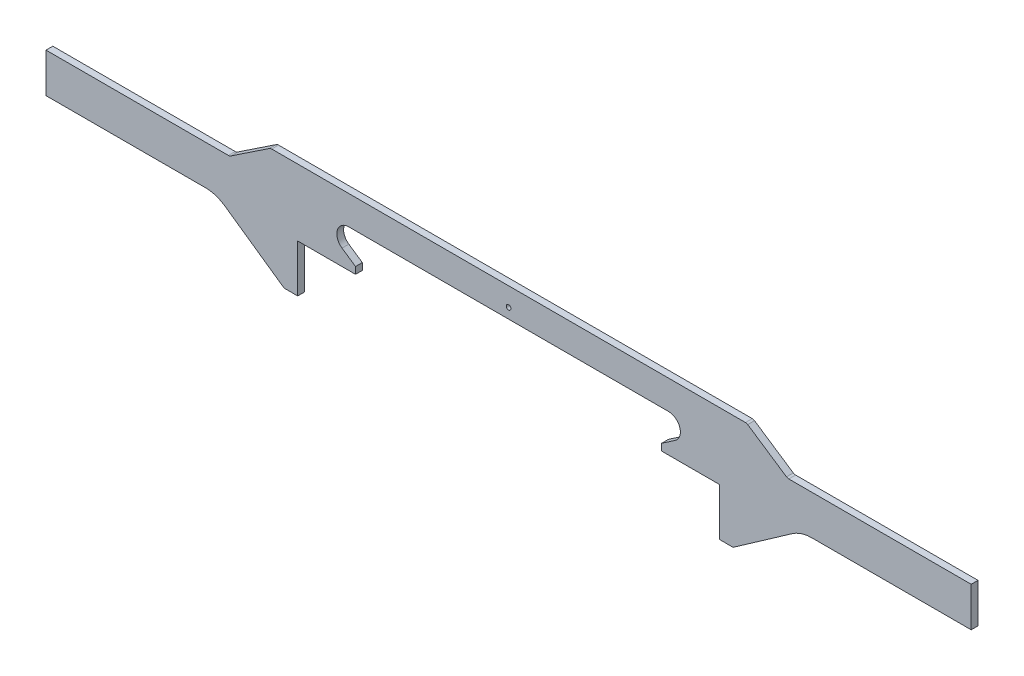
ISO-10303-21;
HEADER;
FILE_DESCRIPTION(('STEP AP214'),'2;1');
FILE_NAME('part.step','',(''),(''),'','','');
FILE_SCHEMA(('AUTOMOTIVE_DESIGN { 1 0 10303 214 1 1 1 1 }'));
ENDSEC;
DATA;
#1=APPLICATION_CONTEXT('core data for automotive mechanical design processes');
#2=APPLICATION_PROTOCOL_DEFINITION('international standard','automotive_design',2000,#1);
#3=PRODUCT_CONTEXT('',#1,'mechanical');
#4=PRODUCT('Part','Part','',(#3));
#5=PRODUCT_RELATED_PRODUCT_CATEGORY('part','',(#4));
#6=PRODUCT_DEFINITION_FORMATION('','',#4);
#7=PRODUCT_DEFINITION_CONTEXT('part definition',#1,'design');
#8=PRODUCT_DEFINITION('design','',#6,#7);
#9=PRODUCT_DEFINITION_SHAPE('','',#8);
#10=(LENGTH_UNIT() NAMED_UNIT(*) SI_UNIT(.MILLI.,.METRE.));
#11=(NAMED_UNIT(*) PLANE_ANGLE_UNIT() SI_UNIT($,.RADIAN.));
#12=(NAMED_UNIT(*) SI_UNIT($,.STERADIAN.) SOLID_ANGLE_UNIT());
#13=UNCERTAINTY_MEASURE_WITH_UNIT(LENGTH_MEASURE(1.E-05),#10,'distance_accuracy_value','');
#14=(GEOMETRIC_REPRESENTATION_CONTEXT(3) GLOBAL_UNCERTAINTY_ASSIGNED_CONTEXT((#13)) GLOBAL_UNIT_ASSIGNED_CONTEXT((#10,
#11,#12)) REPRESENTATION_CONTEXT('',''));
#15=CARTESIAN_POINT('',(0.,0.,0.));
#16=DIRECTION('',(0.,0.,1.));
#17=DIRECTION('',(1.,0.,0.));
#18=AXIS2_PLACEMENT_3D('',#15,#16,#17);
#19=CARTESIAN_POINT('',(-350.,-1.20408176090934E-13,10.));
#20=DIRECTION('',(0.554700196225223,-0.832050294337847,0.));
#21=DIRECTION('',(0.832050294337847,0.554700196225223,0.));
#22=AXIS2_PLACEMENT_3D('',#19,#20,#21);
#23=PLANE('',#22);
#24=DIRECTION('',(-0.832050294337848,-0.554700196225223,0.));
#25=VECTOR('',#24,1.);
#26=CARTESIAN_POINT('',(-350.,-1.20408176090934E-13,0.));
#27=LINE('',#26,#25);
#28=CARTESIAN_POINT('',(-351.511547350959,-1.00769823397302,0.));
#29=VERTEX_POINT('',#28);
#30=CARTESIAN_POINT('',(-408.488452649041,-38.9923017660266,0.));
#31=VERTEX_POINT('',#30);
#32=EDGE_CURVE('E308',#29,#31,#27,.T.);
#33=ORIENTED_EDGE('',*,*,#32,.T.);
#34=DIRECTION('',(0.,0.,-1.));
#35=VECTOR('',#34,1.);
#36=CARTESIAN_POINT('',(-408.488452649041,-38.9923017660266,10.));
#37=LINE('',#36,#35);
#38=CARTESIAN_POINT('',(-408.488452649041,-38.9923017660266,10.));
#39=VERTEX_POINT('',#38);
#40=EDGE_CURVE('E433',#31,#39,#37,.F.);
#41=ORIENTED_EDGE('',*,*,#40,.T.);
#42=DIRECTION('',(-0.832050294337848,-0.554700196225223,0.));
#43=VECTOR('',#42,1.);
#44=CARTESIAN_POINT('',(-350.,-1.20408176090934E-13,10.));
#45=LINE('',#44,#43);
#46=CARTESIAN_POINT('',(-351.511547350959,-1.00769823397302,10.));
#47=VERTEX_POINT('',#46);
#48=EDGE_CURVE('E245',#47,#39,#45,.T.);
#49=ORIENTED_EDGE('',*,*,#48,.F.);
#50=DIRECTION('',(0.,0.,-1.));
#51=VECTOR('',#50,1.);
#52=CARTESIAN_POINT('',(-351.511547350959,-1.00769823397302,10.));
#53=LINE('',#52,#51);
#54=EDGE_CURVE('E430',#47,#29,#53,.T.);
#55=ORIENTED_EDGE('',*,*,#54,.T.);
#56=EDGE_LOOP('',(#33,#41,#49,#55));
#57=FACE_BOUND('',#56,.T.);
#58=ADVANCED_FACE('F36',(#57),#23,.F.);
#59=CARTESIAN_POINT('',(-410.,-39.9999999999995,10.));
#60=DIRECTION('',(0.,-1.,0.));
#61=DIRECTION('',(1.,0.,0.));
#62=AXIS2_PLACEMENT_3D('',#59,#60,#61);
#63=PLANE('',#62);
#64=DIRECTION('',(-1.,0.,0.));
#65=VECTOR('',#64,1.);
#66=CARTESIAN_POINT('',(-410.,-39.9999999999995,10.));
#67=LINE('',#66,#65);
#68=CARTESIAN_POINT('',(-411.816653826392,-39.9999999999995,10.));
#69=VERTEX_POINT('',#68);
#70=CARTESIAN_POINT('',(-680.,-39.9999999999996,10.));
#71=VERTEX_POINT('',#70);
#72=EDGE_CURVE('E232',#69,#71,#67,.T.);
#73=ORIENTED_EDGE('',*,*,#72,.F.);
#74=DIRECTION('',(0.,0.,-1.));
#75=VECTOR('',#74,1.);
#76=CARTESIAN_POINT('',(-411.816653826392,-39.9999999999995,0.));
#77=LINE('',#76,#75);
#78=CARTESIAN_POINT('',(-411.816653826392,-39.9999999999995,0.));
#79=VERTEX_POINT('',#78);
#80=EDGE_CURVE('E428',#69,#79,#77,.T.);
#81=ORIENTED_EDGE('',*,*,#80,.T.);
#82=DIRECTION('',(-1.,0.,0.));
#83=VECTOR('',#82,1.);
#84=CARTESIAN_POINT('',(-410.,-39.9999999999995,0.));
#85=LINE('',#84,#83);
#86=CARTESIAN_POINT('',(-680.,-39.9999999999996,0.));
#87=VERTEX_POINT('',#86);
#88=EDGE_CURVE('E251',#79,#87,#85,.T.);
#89=ORIENTED_EDGE('',*,*,#88,.T.);
#90=DIRECTION('',(0.,0.,-1.));
#91=VECTOR('',#90,1.);
#92=CARTESIAN_POINT('',(-680.,-39.9999999999996,10.));
#93=LINE('',#92,#91);
#94=EDGE_CURVE('E248',#71,#87,#93,.T.);
#95=ORIENTED_EDGE('',*,*,#94,.F.);
#96=EDGE_LOOP('',(#73,#81,#89,#95));
#97=FACE_BOUND('',#96,.T.);
#98=ADVANCED_FACE('F249',(#97),#63,.F.);
#99=CARTESIAN_POINT('',(-680.,-39.9999999999996,10.));
#100=DIRECTION('',(1.,0.,0.));
#101=DIRECTION('',(0.,0.,-1.));
#102=AXIS2_PLACEMENT_3D('',#99,#100,#101);
#103=PLANE('',#102);
#104=DIRECTION('',(0.,-1.,0.));
#105=VECTOR('',#104,1.);
#106=CARTESIAN_POINT('',(-680.,-39.9999999999996,0.));
#107=LINE('',#106,#105);
#108=CARTESIAN_POINT('',(-680.,-97.9999999999996,0.));
#109=VERTEX_POINT('',#108);
#110=EDGE_CURVE('E313',#87,#109,#107,.T.);
#111=ORIENTED_EDGE('',*,*,#110,.T.);
#112=DIRECTION('',(0.,0.,-1.));
#113=VECTOR('',#112,1.);
#114=CARTESIAN_POINT('',(-680.,-97.9999999999996,10.));
#115=LINE('',#114,#113);
#116=CARTESIAN_POINT('',(-680.,-97.9999999999996,10.));
#117=VERTEX_POINT('',#116);
#118=EDGE_CURVE('E255',#117,#109,#115,.T.);
#119=ORIENTED_EDGE('',*,*,#118,.F.);
#120=DIRECTION('',(0.,-1.,0.));
#121=VECTOR('',#120,1.);
#122=CARTESIAN_POINT('',(-680.,-39.9999999999996,10.));
#123=LINE('',#122,#121);
#124=EDGE_CURVE('E237',#71,#117,#123,.T.);
#125=ORIENTED_EDGE('',*,*,#124,.F.);
#126=ORIENTED_EDGE('',*,*,#94,.T.);
#127=EDGE_LOOP('',(#111,#119,#125,#126));
#128=FACE_BOUND('',#127,.T.);
#129=ADVANCED_FACE('F257',(#128),#103,.F.);
#130=CARTESIAN_POINT('',(-680.,-97.9999999999996,10.));
#131=DIRECTION('',(0.,1.,0.));
#132=DIRECTION('',(-1.,0.,0.));
#133=AXIS2_PLACEMENT_3D('',#130,#131,#132);
#134=PLANE('',#133);
#135=DIRECTION('',(1.,0.,0.));
#136=VECTOR('',#135,1.);
#137=CARTESIAN_POINT('',(-680.,-97.9999999999996,0.));
#138=LINE('',#137,#136);
#139=CARTESIAN_POINT('',(-445.735299915897,-97.9999999999996,0.));
#140=VERTEX_POINT('',#139);
#141=EDGE_CURVE('E315',#109,#140,#138,.T.);
#142=ORIENTED_EDGE('',*,*,#141,.T.);
#143=DIRECTION('',(0.,0.,-1.));
#144=VECTOR('',#143,1.);
#145=CARTESIAN_POINT('',(-445.735299915897,-97.9999999999996,10.));
#146=LINE('',#145,#144);
#147=CARTESIAN_POINT('',(-445.735299915897,-97.9999999999996,10.));
#148=VERTEX_POINT('',#147);
#149=EDGE_CURVE('E51',#140,#148,#146,.F.);
#150=ORIENTED_EDGE('',*,*,#149,.T.);
#151=DIRECTION('',(1.,0.,0.));
#152=VECTOR('',#151,1.);
#153=CARTESIAN_POINT('',(-680.,-97.9999999999996,10.));
#154=LINE('',#153,#152);
#155=EDGE_CURVE('E259',#117,#148,#154,.T.);
#156=ORIENTED_EDGE('',*,*,#155,.F.);
#157=ORIENTED_EDGE('',*,*,#118,.T.);
#158=EDGE_LOOP('',(#142,#150,#156,#157));
#159=FACE_BOUND('',#158,.T.);
#160=ADVANCED_FACE('F544',(#159),#134,.F.);
#161=CARTESIAN_POINT('',(-429.970360471948,-97.9999999999996,10.));
#162=DIRECTION('',(0.573576436351047,0.819152044288991,0.));
#163=DIRECTION('',(-0.819152044288991,0.573576436351047,0.));
#164=AXIS2_PLACEMENT_3D('',#161,#162,#163);
#165=PLANE('',#164);
#166=DIRECTION('',(0.819152044288991,-0.573576436351047,0.));
#167=VECTOR('',#166,1.);
#168=CARTESIAN_POINT('',(-429.970360471948,-97.9999999999996,10.));
#169=LINE('',#168,#167);
#170=CARTESIAN_POINT('',(-417.056478098344,-107.04239778555,10.));
#171=VERTEX_POINT('',#170);
#172=CARTESIAN_POINT('',(-330.,-168.,10.));
#173=VERTEX_POINT('',#172);
#174=EDGE_CURVE('E261',#171,#173,#169,.T.);
#175=ORIENTED_EDGE('',*,*,#174,.F.);
#176=DIRECTION('',(0.,0.,-1.));
#177=VECTOR('',#176,1.);
#178=CARTESIAN_POINT('',(-417.056478098344,-107.04239778555,0.));
#179=LINE('',#178,#177);
#180=CARTESIAN_POINT('',(-417.056478098344,-107.04239778555,0.));
#181=VERTEX_POINT('',#180);
#182=EDGE_CURVE('E447',#171,#181,#179,.T.);
#183=ORIENTED_EDGE('',*,*,#182,.T.);
#184=DIRECTION('',(0.819152044288991,-0.573576436351047,0.));
#185=VECTOR('',#184,1.);
#186=CARTESIAN_POINT('',(-429.970360471948,-97.9999999999996,0.));
#187=LINE('',#186,#185);
#188=CARTESIAN_POINT('',(-330.,-168.,0.));
#189=VERTEX_POINT('',#188);
#190=EDGE_CURVE('E317',#181,#189,#187,.T.);
#191=ORIENTED_EDGE('',*,*,#190,.T.);
#192=DIRECTION('',(0.,0.,-1.));
#193=VECTOR('',#192,1.);
#194=CARTESIAN_POINT('',(-330.,-168.,10.));
#195=LINE('',#194,#193);
#196=EDGE_CURVE('E405',#173,#189,#195,.T.);
#197=ORIENTED_EDGE('',*,*,#196,.F.);
#198=EDGE_LOOP('',(#175,#183,#191,#197));
#199=FACE_BOUND('',#198,.T.);
#200=ADVANCED_FACE('F540',(#199),#165,.F.);
#201=CARTESIAN_POINT('',(-330.,-168.,10.));
#202=DIRECTION('',(0.,1.,0.));
#203=DIRECTION('',(0.,0.,1.));
#204=AXIS2_PLACEMENT_3D('',#201,#202,#203);
#205=PLANE('',#204);
#206=DIRECTION('',(1.,0.,0.));
#207=VECTOR('',#206,1.);
#208=CARTESIAN_POINT('',(-330.,-168.,0.));
#209=LINE('',#208,#207);
#210=CARTESIAN_POINT('',(-310.,-168.,0.));
#211=VERTEX_POINT('',#210);
#212=EDGE_CURVE('E319',#189,#211,#209,.T.);
#213=ORIENTED_EDGE('',*,*,#212,.T.);
#214=DIRECTION('',(0.,0.,-1.));
#215=VECTOR('',#214,1.);
#216=CARTESIAN_POINT('',(-310.,-168.,10.));
#217=LINE('',#216,#215);
#218=CARTESIAN_POINT('',(-310.,-168.,10.));
#219=VERTEX_POINT('',#218);
#220=EDGE_CURVE('E402',#219,#211,#217,.T.);
#221=ORIENTED_EDGE('',*,*,#220,.F.);
#222=DIRECTION('',(1.,0.,0.));
#223=VECTOR('',#222,1.);
#224=CARTESIAN_POINT('',(-330.,-168.,10.));
#225=LINE('',#224,#223);
#226=EDGE_CURVE('E266',#173,#219,#225,.T.);
#227=ORIENTED_EDGE('',*,*,#226,.F.);
#228=ORIENTED_EDGE('',*,*,#196,.T.);
#229=EDGE_LOOP('',(#213,#221,#227,#228));
#230=FACE_BOUND('',#229,.T.);
#231=ADVANCED_FACE('F536',(#230),#205,.F.);
#232=CARTESIAN_POINT('',(-310.,-168.,10.));
#233=DIRECTION('',(-1.,0.,0.));
#234=DIRECTION('',(0.,0.,1.));
#235=AXIS2_PLACEMENT_3D('',#232,#233,#234);
#236=PLANE('',#235);
#237=DIRECTION('',(0.,1.,0.));
#238=VECTOR('',#237,1.);
#239=CARTESIAN_POINT('',(-310.,-168.,0.));
#240=LINE('',#239,#238);
#241=CARTESIAN_POINT('',(-310.,-98.,0.));
#242=VERTEX_POINT('',#241);
#243=EDGE_CURVE('E321',#211,#242,#240,.T.);
#244=ORIENTED_EDGE('',*,*,#243,.T.);
#245=DIRECTION('',(0.,0.,-1.));
#246=VECTOR('',#245,1.);
#247=CARTESIAN_POINT('',(-310.,-98.,10.));
#248=LINE('',#247,#246);
#249=CARTESIAN_POINT('',(-310.,-98.,10.));
#250=VERTEX_POINT('',#249);
#251=EDGE_CURVE('E399',#250,#242,#248,.T.);
#252=ORIENTED_EDGE('',*,*,#251,.F.);
#253=DIRECTION('',(0.,1.,0.));
#254=VECTOR('',#253,1.);
#255=CARTESIAN_POINT('',(-310.,-168.,10.));
#256=LINE('',#255,#254);
#257=EDGE_CURVE('E268',#219,#250,#256,.T.);
#258=ORIENTED_EDGE('',*,*,#257,.F.);
#259=ORIENTED_EDGE('',*,*,#220,.T.);
#260=EDGE_LOOP('',(#244,#252,#258,#259));
#261=FACE_BOUND('',#260,.T.);
#262=ADVANCED_FACE('F532',(#261),#236,.F.);
#263=CARTESIAN_POINT('',(-310.,-98.,10.));
#264=DIRECTION('',(0.,1.,0.));
#265=DIRECTION('',(-1.,0.,0.));
#266=AXIS2_PLACEMENT_3D('',#263,#264,#265);
#267=PLANE('',#266);
#268=DIRECTION('',(1.,0.,0.));
#269=VECTOR('',#268,1.);
#270=CARTESIAN_POINT('',(-310.,-98.,0.));
#271=LINE('',#270,#269);
#272=CARTESIAN_POINT('',(-225.,-98.,0.));
#273=VERTEX_POINT('',#272);
#274=EDGE_CURVE('E323',#242,#273,#271,.T.);
#275=ORIENTED_EDGE('',*,*,#274,.T.);
#276=DIRECTION('',(0.,0.,-1.));
#277=VECTOR('',#276,1.);
#278=CARTESIAN_POINT('',(-225.,-98.,10.));
#279=LINE('',#278,#277);
#280=CARTESIAN_POINT('',(-225.,-98.,10.));
#281=VERTEX_POINT('',#280);
#282=EDGE_CURVE('E396',#281,#273,#279,.T.);
#283=ORIENTED_EDGE('',*,*,#282,.F.);
#284=DIRECTION('',(1.,0.,0.));
#285=VECTOR('',#284,1.);
#286=CARTESIAN_POINT('',(-310.,-98.,10.));
#287=LINE('',#286,#285);
#288=EDGE_CURVE('E270',#250,#281,#287,.T.);
#289=ORIENTED_EDGE('',*,*,#288,.F.);
#290=ORIENTED_EDGE('',*,*,#251,.T.);
#291=EDGE_LOOP('',(#275,#283,#289,#290));
#292=FACE_BOUND('',#291,.T.);
#293=ADVANCED_FACE('F527',(#292),#267,.F.);
#294=CARTESIAN_POINT('',(-225.,-98.,10.));
#295=DIRECTION('',(-1.,0.,0.));
#296=DIRECTION('',(0.,0.,1.));
#297=AXIS2_PLACEMENT_3D('',#294,#295,#296);
#298=PLANE('',#297);
#299=DIRECTION('',(0.,1.,0.));
#300=VECTOR('',#299,1.);
#301=CARTESIAN_POINT('',(-225.,-98.,0.));
#302=LINE('',#301,#300);
#303=CARTESIAN_POINT('',(-225.,-88.,0.));
#304=VERTEX_POINT('',#303);
#305=EDGE_CURVE('E325',#273,#304,#302,.T.);
#306=ORIENTED_EDGE('',*,*,#305,.T.);
#307=DIRECTION('',(0.,0.,-1.));
#308=VECTOR('',#307,1.);
#309=CARTESIAN_POINT('',(-225.,-88.,10.));
#310=LINE('',#309,#308);
#311=CARTESIAN_POINT('',(-225.,-88.,10.));
#312=VERTEX_POINT('',#311);
#313=EDGE_CURVE('E393',#312,#304,#310,.T.);
#314=ORIENTED_EDGE('',*,*,#313,.F.);
#315=DIRECTION('',(0.,1.,0.));
#316=VECTOR('',#315,1.);
#317=CARTESIAN_POINT('',(-225.,-98.,10.));
#318=LINE('',#317,#316);
#319=EDGE_CURVE('E272',#281,#312,#318,.T.);
#320=ORIENTED_EDGE('',*,*,#319,.F.);
#321=ORIENTED_EDGE('',*,*,#282,.T.);
#322=EDGE_LOOP('',(#306,#314,#320,#321));
#323=FACE_BOUND('',#322,.T.);
#324=ADVANCED_FACE('F521',(#323),#298,.F.);
#325=CARTESIAN_POINT('',(-225.,-88.,10.));
#326=DIRECTION('',(-0.563371107620391,-0.826203967007284,0.));
#327=DIRECTION('',(0.826203967007284,-0.563371107620391,0.));
#328=AXIS2_PLACEMENT_3D('',#325,#326,#327);
#329=PLANE('',#328);
#330=DIRECTION('',(-0.826203967007284,0.563371107620391,0.));
#331=VECTOR('',#330,1.);
#332=CARTESIAN_POINT('',(-225.,-88.,0.));
#333=LINE('',#332,#331);
#334=CARTESIAN_POINT('',(-244.858994383357,-74.4585694226275,0.));
#335=VERTEX_POINT('',#334);
#336=EDGE_CURVE('E327',#304,#335,#333,.T.);
#337=ORIENTED_EDGE('',*,*,#336,.T.);
#338=DIRECTION('',(0.,0.,-1.));
#339=VECTOR('',#338,1.);
#340=CARTESIAN_POINT('',(-244.858994383357,-74.4585694226275,10.));
#341=LINE('',#340,#339);
#342=CARTESIAN_POINT('',(-244.858994383357,-74.4585694226275,10.));
#343=VERTEX_POINT('',#342);
#344=EDGE_CURVE('E390',#343,#335,#341,.T.);
#345=ORIENTED_EDGE('',*,*,#344,.F.);
#346=DIRECTION('',(-0.826203967007284,0.563371107620391,0.));
#347=VECTOR('',#346,1.);
#348=CARTESIAN_POINT('',(-225.,-88.,10.));
#349=LINE('',#348,#347);
#350=EDGE_CURVE('E274',#312,#343,#349,.T.);
#351=ORIENTED_EDGE('',*,*,#350,.F.);
#352=ORIENTED_EDGE('',*,*,#313,.T.);
#353=EDGE_LOOP('',(#337,#345,#351,#352));
#354=FACE_BOUND('',#353,.T.);
#355=ADVANCED_FACE('F517',(#354),#329,.F.);
#356=CARTESIAN_POINT('',(-235.,-60.,10.));
#357=DIRECTION('',(0.,0.,-1.));
#358=DIRECTION('',(-1.,0.,0.));
#359=AXIS2_PLACEMENT_3D('',#356,#357,#358);
#360=CYLINDRICAL_SURFACE('',#359,17.5);
#361=CARTESIAN_POINT('',(-235.,-60.,0.));
#362=DIRECTION('',(0.,0.,-1.));
#363=DIRECTION('',(1.,0.,0.));
#364=AXIS2_PLACEMENT_3D('',#361,#362,#363);
#365=CIRCLE('',#364,17.5);
#366=CARTESIAN_POINT('',(-235.,-42.5,0.));
#367=VERTEX_POINT('',#366);
#368=EDGE_CURVE('E329',#335,#367,#365,.T.);
#369=ORIENTED_EDGE('',*,*,#368,.T.);
#370=DIRECTION('',(0.,0.,-1.));
#371=VECTOR('',#370,1.);
#372=CARTESIAN_POINT('',(-235.,-42.5,10.));
#373=LINE('',#372,#371);
#374=CARTESIAN_POINT('',(-235.,-42.5,10.));
#375=VERTEX_POINT('',#374);
#376=EDGE_CURVE('E387',#375,#367,#373,.T.);
#377=ORIENTED_EDGE('',*,*,#376,.F.);
#378=CARTESIAN_POINT('',(-235.,-60.,10.));
#379=DIRECTION('',(0.,0.,-1.));
#380=DIRECTION('',(1.,0.,0.));
#381=AXIS2_PLACEMENT_3D('',#378,#379,#380);
#382=CIRCLE('',#381,17.5);
#383=EDGE_CURVE('E276',#343,#375,#382,.T.);
#384=ORIENTED_EDGE('',*,*,#383,.F.);
#385=ORIENTED_EDGE('',*,*,#344,.T.);
#386=EDGE_LOOP('',(#369,#377,#384,#385));
#387=FACE_BOUND('',#386,.T.);
#388=ADVANCED_FACE('F512',(#387),#360,.F.);
#389=CARTESIAN_POINT('',(-235.,-42.5,10.));
#390=DIRECTION('',(0.,1.,0.));
#391=DIRECTION('',(-1.,0.,0.));
#392=AXIS2_PLACEMENT_3D('',#389,#390,#391);
#393=PLANE('',#392);
#394=DIRECTION('',(1.,0.,0.));
#395=VECTOR('',#394,1.);
#396=CARTESIAN_POINT('',(-235.,-42.5,0.));
#397=LINE('',#396,#395);
#398=CARTESIAN_POINT('',(235.,-42.5,0.));
#399=VERTEX_POINT('',#398);
#400=EDGE_CURVE('E331',#367,#399,#397,.T.);
#401=ORIENTED_EDGE('',*,*,#400,.T.);
#402=DIRECTION('',(0.,0.,-1.));
#403=VECTOR('',#402,1.);
#404=CARTESIAN_POINT('',(235.,-42.5,10.));
#405=LINE('',#404,#403);
#406=CARTESIAN_POINT('',(235.,-42.5,10.));
#407=VERTEX_POINT('',#406);
#408=EDGE_CURVE('E384',#407,#399,#405,.T.);
#409=ORIENTED_EDGE('',*,*,#408,.F.);
#410=DIRECTION('',(1.,0.,0.));
#411=VECTOR('',#410,1.);
#412=CARTESIAN_POINT('',(-235.,-42.5,10.));
#413=LINE('',#412,#411);
#414=EDGE_CURVE('E278',#375,#407,#413,.T.);
#415=ORIENTED_EDGE('',*,*,#414,.F.);
#416=ORIENTED_EDGE('',*,*,#376,.T.);
#417=EDGE_LOOP('',(#401,#409,#415,#416));
#418=FACE_BOUND('',#417,.T.);
#419=ADVANCED_FACE('F506',(#418),#393,.F.);
#420=CARTESIAN_POINT('',(235.,-59.9999999999999,10.));
#421=DIRECTION('',(0.,0.,-1.));
#422=DIRECTION('',(-1.,0.,0.));
#423=AXIS2_PLACEMENT_3D('',#420,#421,#422);
#424=CYLINDRICAL_SURFACE('',#423,17.5);
#425=CARTESIAN_POINT('',(235.,-59.9999999999999,0.));
#426=DIRECTION('',(0.,0.,-1.));
#427=DIRECTION('',(1.,0.,0.));
#428=AXIS2_PLACEMENT_3D('',#425,#426,#427);
#429=CIRCLE('',#428,17.5);
#430=CARTESIAN_POINT('',(244.858994383357,-74.4585694226273,0.));
#431=VERTEX_POINT('',#430);
#432=EDGE_CURVE('E333',#399,#431,#429,.T.);
#433=ORIENTED_EDGE('',*,*,#432,.T.);
#434=DIRECTION('',(0.,0.,-1.));
#435=VECTOR('',#434,1.);
#436=CARTESIAN_POINT('',(244.858994383357,-74.4585694226273,10.));
#437=LINE('',#436,#435);
#438=CARTESIAN_POINT('',(244.858994383357,-74.4585694226273,10.));
#439=VERTEX_POINT('',#438);
#440=EDGE_CURVE('E381',#439,#431,#437,.T.);
#441=ORIENTED_EDGE('',*,*,#440,.F.);
#442=CARTESIAN_POINT('',(235.,-59.9999999999999,10.));
#443=DIRECTION('',(0.,0.,-1.));
#444=DIRECTION('',(1.,0.,0.));
#445=AXIS2_PLACEMENT_3D('',#442,#443,#444);
#446=CIRCLE('',#445,17.5);
#447=EDGE_CURVE('E280',#407,#439,#446,.T.);
#448=ORIENTED_EDGE('',*,*,#447,.F.);
#449=ORIENTED_EDGE('',*,*,#408,.T.);
#450=EDGE_LOOP('',(#433,#441,#448,#449));
#451=FACE_BOUND('',#450,.T.);
#452=ADVANCED_FACE('F502',(#451),#424,.F.);
#453=CARTESIAN_POINT('',(225.,-88.,10.));
#454=DIRECTION('',(0.563371107620394,-0.826203967007282,0.));
#455=DIRECTION('',(0.826203967007282,0.563371107620394,0.));
#456=AXIS2_PLACEMENT_3D('',#453,#454,#455);
#457=PLANE('',#456);
#458=DIRECTION('',(-0.826203967007282,-0.563371107620394,0.));
#459=VECTOR('',#458,1.);
#460=CARTESIAN_POINT('',(225.,-88.,0.));
#461=LINE('',#460,#459);
#462=CARTESIAN_POINT('',(225.,-88.,0.));
#463=VERTEX_POINT('',#462);
#464=EDGE_CURVE('E335',#431,#463,#461,.T.);
#465=ORIENTED_EDGE('',*,*,#464,.T.);
#466=DIRECTION('',(0.,0.,-1.));
#467=VECTOR('',#466,1.);
#468=CARTESIAN_POINT('',(225.,-88.,10.));
#469=LINE('',#468,#467);
#470=CARTESIAN_POINT('',(225.,-88.,10.));
#471=VERTEX_POINT('',#470);
#472=EDGE_CURVE('E378',#471,#463,#469,.T.);
#473=ORIENTED_EDGE('',*,*,#472,.F.);
#474=DIRECTION('',(-0.826203967007282,-0.563371107620394,0.));
#475=VECTOR('',#474,1.);
#476=CARTESIAN_POINT('',(225.,-88.,10.));
#477=LINE('',#476,#475);
#478=EDGE_CURVE('E282',#439,#471,#477,.T.);
#479=ORIENTED_EDGE('',*,*,#478,.F.);
#480=ORIENTED_EDGE('',*,*,#440,.T.);
#481=EDGE_LOOP('',(#465,#473,#479,#480));
#482=FACE_BOUND('',#481,.T.);
#483=ADVANCED_FACE('F497',(#482),#457,.F.);
#484=CARTESIAN_POINT('',(225.,-98.,10.));
#485=DIRECTION('',(1.,0.,0.));
#486=DIRECTION('',(0.,1.,0.));
#487=AXIS2_PLACEMENT_3D('',#484,#485,#486);
#488=PLANE('',#487);
#489=DIRECTION('',(0.,-1.,0.));
#490=VECTOR('',#489,1.);
#491=CARTESIAN_POINT('',(225.,-98.,0.));
#492=LINE('',#491,#490);
#493=CARTESIAN_POINT('',(225.,-98.,0.));
#494=VERTEX_POINT('',#493);
#495=EDGE_CURVE('E337',#463,#494,#492,.T.);
#496=ORIENTED_EDGE('',*,*,#495,.T.);
#497=DIRECTION('',(0.,0.,-1.));
#498=VECTOR('',#497,1.);
#499=CARTESIAN_POINT('',(225.,-98.,10.));
#500=LINE('',#499,#498);
#501=CARTESIAN_POINT('',(225.,-98.,10.));
#502=VERTEX_POINT('',#501);
#503=EDGE_CURVE('E375',#502,#494,#500,.T.);
#504=ORIENTED_EDGE('',*,*,#503,.F.);
#505=DIRECTION('',(0.,-1.,0.));
#506=VECTOR('',#505,1.);
#507=CARTESIAN_POINT('',(225.,-98.,10.));
#508=LINE('',#507,#506);
#509=EDGE_CURVE('E284',#471,#502,#508,.T.);
#510=ORIENTED_EDGE('',*,*,#509,.F.);
#511=ORIENTED_EDGE('',*,*,#472,.T.);
#512=EDGE_LOOP('',(#496,#504,#510,#511));
#513=FACE_BOUND('',#512,.T.);
#514=ADVANCED_FACE('F491',(#513),#488,.F.);
#515=CARTESIAN_POINT('',(310.,-97.9999999999999,10.));
#516=DIRECTION('',(0.,1.,0.));
#517=DIRECTION('',(-1.,0.,0.));
#518=AXIS2_PLACEMENT_3D('',#515,#516,#517);
#519=PLANE('',#518);
#520=DIRECTION('',(1.,0.,0.));
#521=VECTOR('',#520,1.);
#522=CARTESIAN_POINT('',(310.,-97.9999999999999,0.));
#523=LINE('',#522,#521);
#524=CARTESIAN_POINT('',(310.,-97.9999999999999,0.));
#525=VERTEX_POINT('',#524);
#526=EDGE_CURVE('E339',#494,#525,#523,.T.);
#527=ORIENTED_EDGE('',*,*,#526,.T.);
#528=DIRECTION('',(0.,0.,-1.));
#529=VECTOR('',#528,1.);
#530=CARTESIAN_POINT('',(310.,-97.9999999999999,10.));
#531=LINE('',#530,#529);
#532=CARTESIAN_POINT('',(310.,-97.9999999999999,10.));
#533=VERTEX_POINT('',#532);
#534=EDGE_CURVE('E372',#533,#525,#531,.T.);
#535=ORIENTED_EDGE('',*,*,#534,.F.);
#536=DIRECTION('',(1.,0.,0.));
#537=VECTOR('',#536,1.);
#538=CARTESIAN_POINT('',(310.,-97.9999999999999,10.));
#539=LINE('',#538,#537);
#540=EDGE_CURVE('E286',#502,#533,#539,.T.);
#541=ORIENTED_EDGE('',*,*,#540,.F.);
#542=ORIENTED_EDGE('',*,*,#503,.T.);
#543=EDGE_LOOP('',(#527,#535,#541,#542));
#544=FACE_BOUND('',#543,.T.);
#545=ADVANCED_FACE('F487',(#544),#519,.F.);
#546=CARTESIAN_POINT('',(310.,-167.999999999999,10.));
#547=DIRECTION('',(1.,0.,0.));
#548=DIRECTION('',(0.,0.,-1.));
#549=AXIS2_PLACEMENT_3D('',#546,#547,#548);
#550=PLANE('',#549);
#551=DIRECTION('',(0.,-1.,0.));
#552=VECTOR('',#551,1.);
#553=CARTESIAN_POINT('',(310.,-167.999999999999,0.));
#554=LINE('',#553,#552);
#555=CARTESIAN_POINT('',(310.,-167.999999999999,0.));
#556=VERTEX_POINT('',#555);
#557=EDGE_CURVE('E341',#525,#556,#554,.T.);
#558=ORIENTED_EDGE('',*,*,#557,.T.);
#559=DIRECTION('',(0.,0.,-1.));
#560=VECTOR('',#559,1.);
#561=CARTESIAN_POINT('',(310.,-167.999999999999,10.));
#562=LINE('',#561,#560);
#563=CARTESIAN_POINT('',(310.,-167.999999999999,10.));
#564=VERTEX_POINT('',#563);
#565=EDGE_CURVE('E369',#564,#556,#562,.T.);
#566=ORIENTED_EDGE('',*,*,#565,.F.);
#567=DIRECTION('',(0.,-1.,0.));
#568=VECTOR('',#567,1.);
#569=CARTESIAN_POINT('',(310.,-167.999999999999,10.));
#570=LINE('',#569,#568);
#571=EDGE_CURVE('E288',#533,#564,#570,.T.);
#572=ORIENTED_EDGE('',*,*,#571,.F.);
#573=ORIENTED_EDGE('',*,*,#534,.T.);
#574=EDGE_LOOP('',(#558,#566,#572,#573));
#575=FACE_BOUND('',#574,.T.);
#576=ADVANCED_FACE('F482',(#575),#550,.F.);
#577=CARTESIAN_POINT('',(330.,-167.999999999999,10.));
#578=DIRECTION('',(0.,1.,0.));
#579=DIRECTION('',(0.,0.,1.));
#580=AXIS2_PLACEMENT_3D('',#577,#578,#579);
#581=PLANE('',#580);
#582=DIRECTION('',(1.,0.,0.));
#583=VECTOR('',#582,1.);
#584=CARTESIAN_POINT('',(330.,-167.999999999999,0.));
#585=LINE('',#584,#583);
#586=CARTESIAN_POINT('',(330.,-167.999999999999,0.));
#587=VERTEX_POINT('',#586);
#588=EDGE_CURVE('E343',#556,#587,#585,.T.);
#589=ORIENTED_EDGE('',*,*,#588,.T.);
#590=DIRECTION('',(0.,0.,-1.));
#591=VECTOR('',#590,1.);
#592=CARTESIAN_POINT('',(330.,-167.999999999999,10.));
#593=LINE('',#592,#591);
#594=CARTESIAN_POINT('',(330.,-167.999999999999,10.));
#595=VERTEX_POINT('',#594);
#596=EDGE_CURVE('E366',#595,#587,#593,.T.);
#597=ORIENTED_EDGE('',*,*,#596,.F.);
#598=DIRECTION('',(1.,0.,0.));
#599=VECTOR('',#598,1.);
#600=CARTESIAN_POINT('',(330.,-167.999999999999,10.));
#601=LINE('',#600,#599);
#602=EDGE_CURVE('E290',#564,#595,#601,.T.);
#603=ORIENTED_EDGE('',*,*,#602,.F.);
#604=ORIENTED_EDGE('',*,*,#565,.T.);
#605=EDGE_LOOP('',(#589,#597,#603,#604));
#606=FACE_BOUND('',#605,.T.);
#607=ADVANCED_FACE('F476',(#606),#581,.F.);
#608=CARTESIAN_POINT('',(429.970360471948,-97.9999999999994,10.));
#609=DIRECTION('',(-0.573576436351049,0.81915204428899,0.));
#610=DIRECTION('',(-0.81915204428899,-0.573576436351049,0.));
#611=AXIS2_PLACEMENT_3D('',#608,#609,#610);
#612=PLANE('',#611);
#613=DIRECTION('',(0.81915204428899,0.573576436351049,0.));
#614=VECTOR('',#613,1.);
#615=CARTESIAN_POINT('',(429.970360471948,-97.9999999999994,0.));
#616=LINE('',#615,#614);
#617=CARTESIAN_POINT('',(417.056478098344,-107.04239778555,0.));
#618=VERTEX_POINT('',#617);
#619=EDGE_CURVE('E345',#587,#618,#616,.T.);
#620=ORIENTED_EDGE('',*,*,#619,.T.);
#621=DIRECTION('',(0.,0.,-1.));
#622=VECTOR('',#621,1.);
#623=CARTESIAN_POINT('',(417.056478098344,-107.04239778555,10.));
#624=LINE('',#623,#622);
#625=CARTESIAN_POINT('',(417.056478098344,-107.04239778555,10.));
#626=VERTEX_POINT('',#625);
#627=EDGE_CURVE('E445',#618,#626,#624,.F.);
#628=ORIENTED_EDGE('',*,*,#627,.T.);
#629=DIRECTION('',(0.81915204428899,0.573576436351049,0.));
#630=VECTOR('',#629,1.);
#631=CARTESIAN_POINT('',(429.970360471948,-97.9999999999994,10.));
#632=LINE('',#631,#630);
#633=EDGE_CURVE('E292',#595,#626,#632,.T.);
#634=ORIENTED_EDGE('',*,*,#633,.F.);
#635=ORIENTED_EDGE('',*,*,#596,.T.);
#636=EDGE_LOOP('',(#620,#628,#634,#635));
#637=FACE_BOUND('',#636,.T.);
#638=ADVANCED_FACE('F472',(#637),#612,.F.);
#639=CARTESIAN_POINT('',(429.970360471948,-97.9999999999994,10.));
#640=DIRECTION('',(0.,1.,0.));
#641=DIRECTION('',(-1.,0.,0.));
#642=AXIS2_PLACEMENT_3D('',#639,#640,#641);
#643=PLANE('',#642);
#644=DIRECTION('',(1.,0.,0.));
#645=VECTOR('',#644,1.);
#646=CARTESIAN_POINT('',(429.970360471948,-97.9999999999994,10.));
#647=LINE('',#646,#645);
#648=CARTESIAN_POINT('',(445.735299915897,-97.9999999999994,10.));
#649=VERTEX_POINT('',#648);
#650=CARTESIAN_POINT('',(680.,-97.9999999999995,10.));
#651=VERTEX_POINT('',#650);
#652=EDGE_CURVE('E295',#649,#651,#647,.T.);
#653=ORIENTED_EDGE('',*,*,#652,.F.);
#654=DIRECTION('',(0.,0.,-1.));
#655=VECTOR('',#654,1.);
#656=CARTESIAN_POINT('',(445.735299915897,-97.9999999999994,0.));
#657=LINE('',#656,#655);
#658=CARTESIAN_POINT('',(445.735299915897,-97.9999999999994,0.));
#659=VERTEX_POINT('',#658);
#660=EDGE_CURVE('E442',#649,#659,#657,.T.);
#661=ORIENTED_EDGE('',*,*,#660,.T.);
#662=DIRECTION('',(1.,0.,0.));
#663=VECTOR('',#662,1.);
#664=CARTESIAN_POINT('',(429.970360471948,-97.9999999999994,0.));
#665=LINE('',#664,#663);
#666=CARTESIAN_POINT('',(680.,-97.9999999999995,0.));
#667=VERTEX_POINT('',#666);
#668=EDGE_CURVE('E348',#659,#667,#665,.T.);
#669=ORIENTED_EDGE('',*,*,#668,.T.);
#670=DIRECTION('',(0.,0.,-1.));
#671=VECTOR('',#670,1.);
#672=CARTESIAN_POINT('',(680.,-97.9999999999995,10.));
#673=LINE('',#672,#671);
#674=EDGE_CURVE('E363',#651,#667,#673,.T.);
#675=ORIENTED_EDGE('',*,*,#674,.F.);
#676=EDGE_LOOP('',(#653,#661,#669,#675));
#677=FACE_BOUND('',#676,.T.);
#678=ADVANCED_FACE('F462',(#677),#643,.F.);
#679=CARTESIAN_POINT('',(680.,-97.9999999999995,10.));
#680=DIRECTION('',(-1.,0.,0.));
#681=DIRECTION('',(0.,0.,1.));
#682=AXIS2_PLACEMENT_3D('',#679,#680,#681);
#683=PLANE('',#682);
#684=DIRECTION('',(0.,1.,0.));
#685=VECTOR('',#684,1.);
#686=CARTESIAN_POINT('',(680.,-97.9999999999995,0.));
#687=LINE('',#686,#685);
#688=CARTESIAN_POINT('',(680.,-39.9999999999995,0.));
#689=VERTEX_POINT('',#688);
#690=EDGE_CURVE('E350',#667,#689,#687,.T.);
#691=ORIENTED_EDGE('',*,*,#690,.T.);
#692=DIRECTION('',(0.,0.,-1.));
#693=VECTOR('',#692,1.);
#694=CARTESIAN_POINT('',(680.,-39.9999999999995,10.));
#695=LINE('',#694,#693);
#696=CARTESIAN_POINT('',(680.,-39.9999999999995,10.));
#697=VERTEX_POINT('',#696);
#698=EDGE_CURVE('E307',#697,#689,#695,.T.);
#699=ORIENTED_EDGE('',*,*,#698,.F.);
#700=DIRECTION('',(0.,1.,0.));
#701=VECTOR('',#700,1.);
#702=CARTESIAN_POINT('',(680.,-97.9999999999995,10.));
#703=LINE('',#702,#701);
#704=EDGE_CURVE('E297',#651,#697,#703,.T.);
#705=ORIENTED_EDGE('',*,*,#704,.F.);
#706=ORIENTED_EDGE('',*,*,#674,.T.);
#707=EDGE_LOOP('',(#691,#699,#705,#706));
#708=FACE_BOUND('',#707,.T.);
#709=ADVANCED_FACE('F619',(#708),#683,.F.);
#710=CARTESIAN_POINT('',(410.,-39.9999999999994,10.));
#711=DIRECTION('',(0.,-1.,0.));
#712=DIRECTION('',(1.,0.,0.));
#713=AXIS2_PLACEMENT_3D('',#710,#711,#712);
#714=PLANE('',#713);
#715=DIRECTION('',(-1.,0.,0.));
#716=VECTOR('',#715,1.);
#717=CARTESIAN_POINT('',(410.,-39.9999999999994,0.));
#718=LINE('',#717,#716);
#719=CARTESIAN_POINT('',(411.816653826392,-39.9999999999994,0.));
#720=VERTEX_POINT('',#719);
#721=EDGE_CURVE('E352',#689,#720,#718,.T.);
#722=ORIENTED_EDGE('',*,*,#721,.T.);
#723=DIRECTION('',(0.,0.,-1.));
#724=VECTOR('',#723,1.);
#725=CARTESIAN_POINT('',(411.816653826392,-39.9999999999994,10.));
#726=LINE('',#725,#724);
#727=CARTESIAN_POINT('',(411.816653826392,-39.9999999999994,10.));
#728=VERTEX_POINT('',#727);
#729=EDGE_CURVE('E413',#720,#728,#726,.F.);
#730=ORIENTED_EDGE('',*,*,#729,.T.);
#731=DIRECTION('',(-1.,0.,0.));
#732=VECTOR('',#731,1.);
#733=CARTESIAN_POINT('',(410.,-39.9999999999994,10.));
#734=LINE('',#733,#732);
#735=EDGE_CURVE('E299',#697,#728,#734,.T.);
#736=ORIENTED_EDGE('',*,*,#735,.F.);
#737=ORIENTED_EDGE('',*,*,#698,.T.);
#738=EDGE_LOOP('',(#722,#730,#736,#737));
#739=FACE_BOUND('',#738,.T.);
#740=ADVANCED_FACE('F616',(#739),#714,.F.);
#741=CARTESIAN_POINT('',(350.,0.,10.));
#742=DIRECTION('',(-0.554700196225224,-0.832050294337847,0.));
#743=DIRECTION('',(0.832050294337847,-0.554700196225224,0.));
#744=AXIS2_PLACEMENT_3D('',#741,#742,#743);
#745=PLANE('',#744);
#746=DIRECTION('',(-0.832050294337847,0.554700196225224,0.));
#747=VECTOR('',#746,1.);
#748=CARTESIAN_POINT('',(350.,0.,10.));
#749=LINE('',#748,#747);
#750=CARTESIAN_POINT('',(408.488452649041,-38.9923017660265,10.));
#751=VERTEX_POINT('',#750);
#752=CARTESIAN_POINT('',(351.511547350959,-1.00769823397286,10.));
#753=VERTEX_POINT('',#752);
#754=EDGE_CURVE('E302',#751,#753,#749,.T.);
#755=ORIENTED_EDGE('',*,*,#754,.F.);
#756=DIRECTION('',(0.,0.,-1.));
#757=VECTOR('',#756,1.);
#758=CARTESIAN_POINT('',(408.488452649041,-38.9923017660265,0.));
#759=LINE('',#758,#757);
#760=CARTESIAN_POINT('',(408.488452649041,-38.9923017660265,0.));
#761=VERTEX_POINT('',#760);
#762=EDGE_CURVE('E410',#751,#761,#759,.T.);
#763=ORIENTED_EDGE('',*,*,#762,.T.);
#764=DIRECTION('',(-0.832050294337847,0.554700196225224,0.));
#765=VECTOR('',#764,1.);
#766=CARTESIAN_POINT('',(350.,0.,0.));
#767=LINE('',#766,#765);
#768=CARTESIAN_POINT('',(351.511547350959,-1.00769823397286,0.));
#769=VERTEX_POINT('',#768);
#770=EDGE_CURVE('E355',#761,#769,#767,.T.);
#771=ORIENTED_EDGE('',*,*,#770,.T.);
#772=DIRECTION('',(0.,0.,-1.));
#773=VECTOR('',#772,1.);
#774=CARTESIAN_POINT('',(351.511547350959,-1.00769823397287,10.));
#775=LINE('',#774,#773);
#776=EDGE_CURVE('E254',#769,#753,#775,.F.);
#777=ORIENTED_EDGE('',*,*,#776,.T.);
#778=EDGE_LOOP('',(#755,#763,#771,#777));
#779=FACE_BOUND('',#778,.T.);
#780=ADVANCED_FACE('F588',(#779),#745,.F.);
#781=CARTESIAN_POINT('',(-350.,-1.20408176090934E-13,10.));
#782=DIRECTION('',(0.,-1.,0.));
#783=DIRECTION('',(1.,0.,0.));
#784=AXIS2_PLACEMENT_3D('',#781,#782,#783);
#785=PLANE('',#784);
#786=DIRECTION('',(-1.,0.,0.));
#787=VECTOR('',#786,1.);
#788=CARTESIAN_POINT('',(-350.,-1.20408176090934E-13,10.));
#789=LINE('',#788,#787);
#790=CARTESIAN_POINT('',(348.183346173608,0.,10.));
#791=VERTEX_POINT('',#790);
#792=CARTESIAN_POINT('',(-348.183346173608,-1.19991585446342E-13,10.));
#793=VERTEX_POINT('',#792);
#794=EDGE_CURVE('E304',#791,#793,#789,.T.);
#795=ORIENTED_EDGE('',*,*,#794,.F.);
#796=DIRECTION('',(0.,0.,-1.));
#797=VECTOR('',#796,1.);
#798=CARTESIAN_POINT('',(348.183346173608,0.,10.));
#799=LINE('',#798,#797);
#800=CARTESIAN_POINT('',(348.183346173608,0.,0.));
#801=VERTEX_POINT('',#800);
#802=EDGE_CURVE('E417',#791,#801,#799,.T.);
#803=ORIENTED_EDGE('',*,*,#802,.T.);
#804=DIRECTION('',(-1.,0.,0.));
#805=VECTOR('',#804,1.);
#806=CARTESIAN_POINT('',(-350.,-1.20408176090934E-13,0.));
#807=LINE('',#806,#805);
#808=CARTESIAN_POINT('',(-348.183346173608,-1.19991585446342E-13,0.));
#809=VERTEX_POINT('',#808);
#810=EDGE_CURVE('E358',#801,#809,#807,.T.);
#811=ORIENTED_EDGE('',*,*,#810,.T.);
#812=DIRECTION('',(0.,0.,-1.));
#813=VECTOR('',#812,1.);
#814=CARTESIAN_POINT('',(-348.183346173608,-1.19991585446342E-13,10.));
#815=LINE('',#814,#813);
#816=EDGE_CURVE('E415',#809,#793,#815,.F.);
#817=ORIENTED_EDGE('',*,*,#816,.T.);
#818=EDGE_LOOP('',(#795,#803,#811,#817));
#819=FACE_BOUND('',#818,.T.);
#820=ADVANCED_FACE('F595',(#819),#785,.F.);
#821=CARTESIAN_POINT('',(-235.,-60.,10.));
#822=DIRECTION('',(0.,0.,1.));
#823=DIRECTION('',(1.,0.,0.));
#824=AXIS2_PLACEMENT_3D('',#821,#822,#823);
#825=PLANE('',#824);
#826=CARTESIAN_POINT('',(0.,-27.5,10.));
#827=DIRECTION('',(0.,0.,1.));
#828=DIRECTION('',(1.,0.,0.));
#829=AXIS2_PLACEMENT_3D('',#826,#827,#828);
#830=CIRCLE('',#829,3.4);
#831=CARTESIAN_POINT('',(3.4,-27.5,10.));
#832=VERTEX_POINT('',#831);
#833=EDGE_CURVE('E600',#832,#832,#830,.T.);
#834=ORIENTED_EDGE('',*,*,#833,.F.);
#835=EDGE_LOOP('',(#834));
#836=FACE_BOUND('',#835,.T.);
#837=ORIENTED_EDGE('',*,*,#754,.T.);
#838=CARTESIAN_POINT('',(348.183346173608,-5.99999999999996,10.));
#839=DIRECTION('',(0.,0.,1.));
#840=DIRECTION('',(1.,0.,0.));
#841=AXIS2_PLACEMENT_3D('',#838,#839,#840);
#842=CIRCLE('',#841,6.);
#843=EDGE_CURVE('E426',#753,#791,#842,.T.);
#844=ORIENTED_EDGE('',*,*,#843,.T.);
#845=ORIENTED_EDGE('',*,*,#794,.T.);
#846=CARTESIAN_POINT('',(-348.183346173608,-6.00000000000012,10.));
#847=DIRECTION('',(0.,0.,1.));
#848=DIRECTION('',(1.,0.,0.));
#849=AXIS2_PLACEMENT_3D('',#846,#847,#848);
#850=CIRCLE('',#849,6.);
#851=EDGE_CURVE('E424',#793,#47,#850,.T.);
#852=ORIENTED_EDGE('',*,*,#851,.T.);
#853=ORIENTED_EDGE('',*,*,#48,.T.);
#854=CARTESIAN_POINT('',(-411.816653826392,-33.9999999999995,10.));
#855=DIRECTION('',(0.,0.,1.));
#856=DIRECTION('',(1.,0.,0.));
#857=AXIS2_PLACEMENT_3D('',#854,#855,#856);
#858=CIRCLE('',#857,6.);
#859=EDGE_CURVE('E241',#39,#69,#858,.F.);
#860=ORIENTED_EDGE('',*,*,#859,.T.);
#861=ORIENTED_EDGE('',*,*,#72,.T.);
#862=ORIENTED_EDGE('',*,*,#124,.T.);
#863=ORIENTED_EDGE('',*,*,#155,.T.);
#864=CARTESIAN_POINT('',(-445.735299915897,-148.,10.));
#865=DIRECTION('',(0.,0.,1.));
#866=DIRECTION('',(1.,0.,0.));
#867=AXIS2_PLACEMENT_3D('',#864,#865,#866);
#868=CIRCLE('',#867,50.);
#869=EDGE_CURVE('E11',#148,#171,#868,.F.);
#870=ORIENTED_EDGE('',*,*,#869,.T.);
#871=ORIENTED_EDGE('',*,*,#174,.T.);
#872=ORIENTED_EDGE('',*,*,#226,.T.);
#873=ORIENTED_EDGE('',*,*,#257,.T.);
#874=ORIENTED_EDGE('',*,*,#288,.T.);
#875=ORIENTED_EDGE('',*,*,#319,.T.);
#876=ORIENTED_EDGE('',*,*,#350,.T.);
#877=ORIENTED_EDGE('',*,*,#383,.T.);
#878=ORIENTED_EDGE('',*,*,#414,.T.);
#879=ORIENTED_EDGE('',*,*,#447,.T.);
#880=ORIENTED_EDGE('',*,*,#478,.T.);
#881=ORIENTED_EDGE('',*,*,#509,.T.);
#882=ORIENTED_EDGE('',*,*,#540,.T.);
#883=ORIENTED_EDGE('',*,*,#571,.T.);
#884=ORIENTED_EDGE('',*,*,#602,.T.);
#885=ORIENTED_EDGE('',*,*,#633,.T.);
#886=CARTESIAN_POINT('',(445.735299915897,-147.999999999999,10.));
#887=DIRECTION('',(0.,0.,1.));
#888=DIRECTION('',(1.,0.,0.));
#889=AXIS2_PLACEMENT_3D('',#886,#887,#888);
#890=CIRCLE('',#889,50.);
#891=EDGE_CURVE('E453',#626,#649,#890,.F.);
#892=ORIENTED_EDGE('',*,*,#891,.T.);
#893=ORIENTED_EDGE('',*,*,#652,.T.);
#894=ORIENTED_EDGE('',*,*,#704,.T.);
#895=ORIENTED_EDGE('',*,*,#735,.T.);
#896=CARTESIAN_POINT('',(411.816653826392,-33.9999999999994,10.));
#897=DIRECTION('',(0.,0.,1.));
#898=DIRECTION('',(1.,0.,0.));
#899=AXIS2_PLACEMENT_3D('',#896,#897,#898);
#900=CIRCLE('',#899,6.);
#901=EDGE_CURVE('E437',#728,#751,#900,.F.);
#902=ORIENTED_EDGE('',*,*,#901,.T.);
#903=EDGE_LOOP('',(#837,#844,#845,#852,#853,#860,#861,#862,#863,#870,#871,#872,#873,#874,#875,
#876,#877,#878,#879,#880,#881,#882,#883,#884,#885,#892,#893,#894,#895,#902));
#904=FACE_BOUND('',#903,.T.);
#905=ADVANCED_FACE('F235',(#836,#904),#825,.T.);
#906=CARTESIAN_POINT('',(-235.,-60.,0.));
#907=DIRECTION('',(0.,0.,1.));
#908=DIRECTION('',(1.,0.,0.));
#909=AXIS2_PLACEMENT_3D('',#906,#907,#908);
#910=PLANE('',#909);
#911=CARTESIAN_POINT('',(0.,-27.5,0.));
#912=DIRECTION('',(0.,0.,1.));
#913=DIRECTION('',(1.,0.,0.));
#914=AXIS2_PLACEMENT_3D('',#911,#912,#913);
#915=CIRCLE('',#914,3.4);
#916=CARTESIAN_POINT('',(3.4,-27.5,0.));
#917=VERTEX_POINT('',#916);
#918=EDGE_CURVE('E311',#917,#917,#915,.T.);
#919=ORIENTED_EDGE('',*,*,#918,.T.);
#920=EDGE_LOOP('',(#919));
#921=FACE_BOUND('',#920,.T.);
#922=ORIENTED_EDGE('',*,*,#810,.F.);
#923=CARTESIAN_POINT('',(348.183346173608,-5.99999999999996,0.));
#924=DIRECTION('',(0.,0.,1.));
#925=DIRECTION('',(1.,0.,0.));
#926=AXIS2_PLACEMENT_3D('',#923,#924,#925);
#927=CIRCLE('',#926,6.);
#928=EDGE_CURVE('E422',#801,#769,#927,.F.);
#929=ORIENTED_EDGE('',*,*,#928,.T.);
#930=ORIENTED_EDGE('',*,*,#770,.F.);
#931=CARTESIAN_POINT('',(411.816653826392,-33.9999999999994,0.));
#932=DIRECTION('',(0.,0.,1.));
#933=DIRECTION('',(1.,0.,0.));
#934=AXIS2_PLACEMENT_3D('',#931,#932,#933);
#935=CIRCLE('',#934,6.);
#936=EDGE_CURVE('E435',#761,#720,#935,.T.);
#937=ORIENTED_EDGE('',*,*,#936,.T.);
#938=ORIENTED_EDGE('',*,*,#721,.F.);
#939=ORIENTED_EDGE('',*,*,#690,.F.);
#940=ORIENTED_EDGE('',*,*,#668,.F.);
#941=CARTESIAN_POINT('',(445.735299915897,-147.999999999999,0.));
#942=DIRECTION('',(0.,0.,1.));
#943=DIRECTION('',(1.,0.,0.));
#944=AXIS2_PLACEMENT_3D('',#941,#942,#943);
#945=CIRCLE('',#944,50.);
#946=EDGE_CURVE('E451',#659,#618,#945,.T.);
#947=ORIENTED_EDGE('',*,*,#946,.T.);
#948=ORIENTED_EDGE('',*,*,#619,.F.);
#949=ORIENTED_EDGE('',*,*,#588,.F.);
#950=ORIENTED_EDGE('',*,*,#557,.F.);
#951=ORIENTED_EDGE('',*,*,#526,.F.);
#952=ORIENTED_EDGE('',*,*,#495,.F.);
#953=ORIENTED_EDGE('',*,*,#464,.F.);
#954=ORIENTED_EDGE('',*,*,#432,.F.);
#955=ORIENTED_EDGE('',*,*,#400,.F.);
#956=ORIENTED_EDGE('',*,*,#368,.F.);
#957=ORIENTED_EDGE('',*,*,#336,.F.);
#958=ORIENTED_EDGE('',*,*,#305,.F.);
#959=ORIENTED_EDGE('',*,*,#274,.F.);
#960=ORIENTED_EDGE('',*,*,#243,.F.);
#961=ORIENTED_EDGE('',*,*,#212,.F.);
#962=ORIENTED_EDGE('',*,*,#190,.F.);
#963=CARTESIAN_POINT('',(-445.735299915897,-148.,0.));
#964=DIRECTION('',(0.,0.,1.));
#965=DIRECTION('',(1.,0.,0.));
#966=AXIS2_PLACEMENT_3D('',#963,#964,#965);
#967=CIRCLE('',#966,50.);
#968=EDGE_CURVE('E44',#181,#140,#967,.T.);
#969=ORIENTED_EDGE('',*,*,#968,.T.);
#970=ORIENTED_EDGE('',*,*,#141,.F.);
#971=ORIENTED_EDGE('',*,*,#110,.F.);
#972=ORIENTED_EDGE('',*,*,#88,.F.);
#973=CARTESIAN_POINT('',(-411.816653826392,-33.9999999999995,0.));
#974=DIRECTION('',(0.,0.,1.));
#975=DIRECTION('',(1.,0.,0.));
#976=AXIS2_PLACEMENT_3D('',#973,#974,#975);
#977=CIRCLE('',#976,6.);
#978=EDGE_CURVE('E439',#79,#31,#977,.T.);
#979=ORIENTED_EDGE('',*,*,#978,.T.);
#980=ORIENTED_EDGE('',*,*,#32,.F.);
#981=CARTESIAN_POINT('',(-348.183346173608,-6.00000000000012,0.));
#982=DIRECTION('',(0.,0.,1.));
#983=DIRECTION('',(1.,0.,0.));
#984=AXIS2_PLACEMENT_3D('',#981,#982,#983);
#985=CIRCLE('',#984,6.);
#986=EDGE_CURVE('E420',#29,#809,#985,.F.);
#987=ORIENTED_EDGE('',*,*,#986,.T.);
#988=EDGE_LOOP('',(#922,#929,#930,#937,#938,#939,#940,#947,#948,#949,#950,#951,#952,#953,#954,
#955,#956,#957,#958,#959,#960,#961,#962,#969,#970,#971,#972,#979,#980,#987));
#989=FACE_BOUND('',#988,.T.);
#990=ADVANCED_FACE('F468',(#921,#989),#910,.F.);
#991=CARTESIAN_POINT('',(411.816653826392,-33.9999999999994,10.));
#992=DIRECTION('',(0.,0.,1.));
#993=DIRECTION('',(1.,0.,0.));
#994=AXIS2_PLACEMENT_3D('',#991,#992,#993);
#995=CYLINDRICAL_SURFACE('',#994,6.);
#996=ORIENTED_EDGE('',*,*,#901,.F.);
#997=ORIENTED_EDGE('',*,*,#729,.F.);
#998=ORIENTED_EDGE('',*,*,#936,.F.);
#999=ORIENTED_EDGE('',*,*,#762,.F.);
#1000=EDGE_LOOP('',(#996,#997,#998,#999));
#1001=FACE_BOUND('',#1000,.T.);
#1002=ADVANCED_FACE('F563',(#1001),#995,.F.);
#1003=CARTESIAN_POINT('',(348.183346173608,-5.99999999999996,10.));
#1004=DIRECTION('',(0.,0.,-1.));
#1005=DIRECTION('',(-1.,0.,0.));
#1006=AXIS2_PLACEMENT_3D('',#1003,#1004,#1005);
#1007=CYLINDRICAL_SURFACE('',#1006,6.);
#1008=ORIENTED_EDGE('',*,*,#843,.F.);
#1009=ORIENTED_EDGE('',*,*,#776,.F.);
#1010=ORIENTED_EDGE('',*,*,#928,.F.);
#1011=ORIENTED_EDGE('',*,*,#802,.F.);
#1012=EDGE_LOOP('',(#1008,#1009,#1010,#1011));
#1013=FACE_BOUND('',#1012,.T.);
#1014=ADVANCED_FACE('F554',(#1013),#1007,.T.);
#1015=CARTESIAN_POINT('',(-411.816653826392,-33.9999999999995,10.));
#1016=DIRECTION('',(0.,0.,1.));
#1017=DIRECTION('',(1.,0.,0.));
#1018=AXIS2_PLACEMENT_3D('',#1015,#1016,#1017);
#1019=CYLINDRICAL_SURFACE('',#1018,6.);
#1020=ORIENTED_EDGE('',*,*,#859,.F.);
#1021=ORIENTED_EDGE('',*,*,#40,.F.);
#1022=ORIENTED_EDGE('',*,*,#978,.F.);
#1023=ORIENTED_EDGE('',*,*,#80,.F.);
#1024=EDGE_LOOP('',(#1020,#1021,#1022,#1023));
#1025=FACE_BOUND('',#1024,.T.);
#1026=ADVANCED_FACE('F551',(#1025),#1019,.F.);
#1027=CARTESIAN_POINT('',(-348.183346173608,-6.00000000000012,10.));
#1028=DIRECTION('',(0.,0.,-1.));
#1029=DIRECTION('',(-1.,0.,0.));
#1030=AXIS2_PLACEMENT_3D('',#1027,#1028,#1029);
#1031=CYLINDRICAL_SURFACE('',#1030,6.);
#1032=ORIENTED_EDGE('',*,*,#851,.F.);
#1033=ORIENTED_EDGE('',*,*,#816,.F.);
#1034=ORIENTED_EDGE('',*,*,#986,.F.);
#1035=ORIENTED_EDGE('',*,*,#54,.F.);
#1036=EDGE_LOOP('',(#1032,#1033,#1034,#1035));
#1037=FACE_BOUND('',#1036,.T.);
#1038=ADVANCED_FACE('F553',(#1037),#1031,.T.);
#1039=CARTESIAN_POINT('',(0.,-27.5,10.));
#1040=DIRECTION('',(0.,0.,1.));
#1041=DIRECTION('',(1.,0.,0.));
#1042=AXIS2_PLACEMENT_3D('',#1039,#1040,#1041);
#1043=CYLINDRICAL_SURFACE('',#1042,3.4);
#1044=ORIENTED_EDGE('',*,*,#833,.T.);
#1045=EDGE_LOOP('',(#1044));
#1046=FACE_BOUND('',#1045,.T.);
#1047=ORIENTED_EDGE('',*,*,#918,.F.);
#1048=EDGE_LOOP('',(#1047));
#1049=FACE_BOUND('',#1048,.T.);
#1050=ADVANCED_FACE('F560',(#1046,#1049),#1043,.F.);
#1051=CARTESIAN_POINT('',(445.735299915897,-147.999999999999,10.));
#1052=DIRECTION('',(0.,0.,1.));
#1053=DIRECTION('',(1.,0.,0.));
#1054=AXIS2_PLACEMENT_3D('',#1051,#1052,#1053);
#1055=CYLINDRICAL_SURFACE('',#1054,50.);
#1056=ORIENTED_EDGE('',*,*,#891,.F.);
#1057=ORIENTED_EDGE('',*,*,#627,.F.);
#1058=ORIENTED_EDGE('',*,*,#946,.F.);
#1059=ORIENTED_EDGE('',*,*,#660,.F.);
#1060=EDGE_LOOP('',(#1056,#1057,#1058,#1059));
#1061=FACE_BOUND('',#1060,.T.);
#1062=ADVANCED_FACE('F465',(#1061),#1055,.F.);
#1063=CARTESIAN_POINT('',(-445.735299915897,-148.,10.));
#1064=DIRECTION('',(0.,0.,1.));
#1065=DIRECTION('',(1.,0.,0.));
#1066=AXIS2_PLACEMENT_3D('',#1063,#1064,#1065);
#1067=CYLINDRICAL_SURFACE('',#1066,50.);
#1068=ORIENTED_EDGE('',*,*,#869,.F.);
#1069=ORIENTED_EDGE('',*,*,#149,.F.);
#1070=ORIENTED_EDGE('',*,*,#968,.F.);
#1071=ORIENTED_EDGE('',*,*,#182,.F.);
#1072=EDGE_LOOP('',(#1068,#1069,#1070,#1071));
#1073=FACE_BOUND('',#1072,.T.);
#1074=ADVANCED_FACE('F38',(#1073),#1067,.F.);
#1075=CLOSED_SHELL('',(#58,#98,#129,#160,#200,#231,#262,#293,#324,#355,#388,#419,#452,#483,#514,
#545,#576,#607,#638,#678,#709,#740,#780,#820,#905,#990,#1002,#1014,#1026,#1038,#1050,#1062,#1074));
#1076=MANIFOLD_SOLID_BREP('B2',#1075);
#1077=ADVANCED_BREP_SHAPE_REPRESENTATION('',(#18,#1076),#14);
#1078=SHAPE_DEFINITION_REPRESENTATION(#9,#1077);
ENDSEC;
END-ISO-10303-21;
